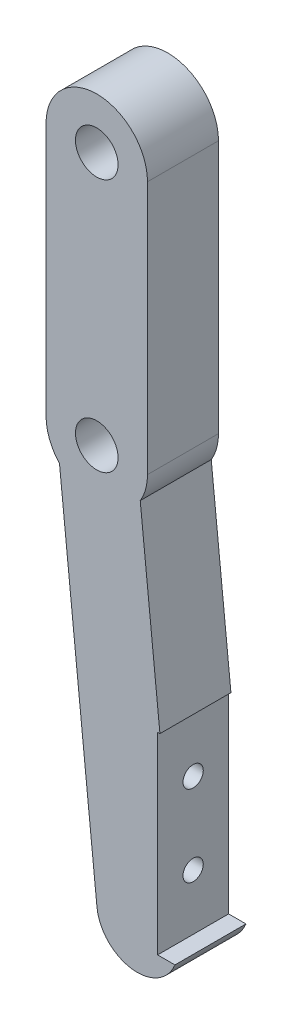
ISO-10303-21;
HEADER;
FILE_DESCRIPTION(('STEP AP214'),'2;1');
FILE_NAME('part.step','',(''),(''),'','','');
FILE_SCHEMA(('AUTOMOTIVE_DESIGN { 1 0 10303 214 1 1 1 1 }'));
ENDSEC;
DATA;
#1=APPLICATION_CONTEXT('core data for automotive mechanical design processes');
#2=APPLICATION_PROTOCOL_DEFINITION('international standard','automotive_design',2000,#1);
#3=PRODUCT_CONTEXT('',#1,'mechanical');
#4=PRODUCT('Part','Part','',(#3));
#5=PRODUCT_RELATED_PRODUCT_CATEGORY('part','',(#4));
#6=PRODUCT_DEFINITION_FORMATION('','',#4);
#7=PRODUCT_DEFINITION_CONTEXT('part definition',#1,'design');
#8=PRODUCT_DEFINITION('design','',#6,#7);
#9=PRODUCT_DEFINITION_SHAPE('','',#8);
#10=(LENGTH_UNIT() NAMED_UNIT(*) SI_UNIT(.MILLI.,.METRE.));
#11=(NAMED_UNIT(*) PLANE_ANGLE_UNIT() SI_UNIT($,.RADIAN.));
#12=(NAMED_UNIT(*) SI_UNIT($,.STERADIAN.) SOLID_ANGLE_UNIT());
#13=UNCERTAINTY_MEASURE_WITH_UNIT(LENGTH_MEASURE(1.E-05),#10,'distance_accuracy_value','');
#14=(GEOMETRIC_REPRESENTATION_CONTEXT(3) GLOBAL_UNCERTAINTY_ASSIGNED_CONTEXT((#13)) GLOBAL_UNIT_ASSIGNED_CONTEXT((#10,
#11,#12)) REPRESENTATION_CONTEXT('',''));
#15=CARTESIAN_POINT('',(0.,0.,0.));
#16=DIRECTION('',(0.,0.,1.));
#17=DIRECTION('',(1.,0.,0.));
#18=AXIS2_PLACEMENT_3D('',#15,#16,#17);
#19=CARTESIAN_POINT('',(3.4,-60.,3.5));
#20=DIRECTION('',(-1.,0.,0.));
#21=DIRECTION('',(0.,0.,1.));
#22=AXIS2_PLACEMENT_3D('',#19,#20,#21);
#23=PLANE('',#22);
#24=CARTESIAN_POINT('',(3.4,-60.,3.5));
#25=DIRECTION('',(-1.,0.,0.));
#26=DIRECTION('',(0.,0.,-1.));
#27=AXIS2_PLACEMENT_3D('',#24,#25,#26);
#28=CIRCLE('',#27,1.);
#29=CARTESIAN_POINT('',(3.4,-60.,2.5));
#30=VERTEX_POINT('',#29);
#31=EDGE_CURVE('E10',#30,#30,#28,.T.);
#32=ORIENTED_EDGE('',*,*,#31,.F.);
#33=EDGE_LOOP('',(#32));
#34=FACE_BOUND('',#33,.T.);
#35=ADVANCED_FACE('F16',(#34),#23,.F.);
#36=CARTESIAN_POINT('',(3.4,-52.,3.5));
#37=DIRECTION('',(-1.,0.,0.));
#38=DIRECTION('',(0.,0.,1.));
#39=AXIS2_PLACEMENT_3D('',#36,#37,#38);
#40=PLANE('',#39);
#41=CARTESIAN_POINT('',(3.4,-52.,3.5));
#42=DIRECTION('',(-1.,0.,0.));
#43=DIRECTION('',(0.,0.,-1.));
#44=AXIS2_PLACEMENT_3D('',#41,#42,#43);
#45=CIRCLE('',#44,1.);
#46=CARTESIAN_POINT('',(3.4,-52.,2.5));
#47=VERTEX_POINT('',#46);
#48=EDGE_CURVE('E43',#47,#47,#45,.T.);
#49=ORIENTED_EDGE('',*,*,#48,.F.);
#50=EDGE_LOOP('',(#49));
#51=FACE_BOUND('',#50,.T.);
#52=ADVANCED_FACE('F388',(#51),#40,.F.);
#53=CARTESIAN_POINT('',(6.,-60.,3.5));
#54=DIRECTION('',(-1.,0.,0.));
#55=DIRECTION('',(0.,0.,-1.));
#56=AXIS2_PLACEMENT_3D('',#53,#54,#55);
#57=CYLINDRICAL_SURFACE('',#56,1.);
#58=DIRECTION('',(-1.,0.,0.));
#59=VECTOR('',#58,1.);
#60=CARTESIAN_POINT('',(6.,-60.,2.5));
#61=LINE('',#60,#59);
#62=CARTESIAN_POINT('',(6.,-60.,2.5));
#63=VERTEX_POINT('',#62);
#64=EDGE_CURVE('E24',#63,#30,#61,.T.);
#65=ORIENTED_EDGE('',*,*,#64,.F.);
#66=CARTESIAN_POINT('',(6.,-60.,3.5));
#67=DIRECTION('',(-1.,0.,0.));
#68=DIRECTION('',(0.,0.,-1.));
#69=AXIS2_PLACEMENT_3D('',#66,#67,#68);
#70=CIRCLE('',#69,1.);
#71=EDGE_CURVE('E223',#63,#63,#70,.T.);
#72=ORIENTED_EDGE('',*,*,#71,.F.);
#73=ORIENTED_EDGE('',*,*,#64,.T.);
#74=ORIENTED_EDGE('',*,*,#31,.T.);
#75=EDGE_LOOP('',(#65,#72,#73,#74));
#76=FACE_BOUND('',#75,.T.);
#77=ADVANCED_FACE('F393',(#76),#57,.F.);
#78=CARTESIAN_POINT('',(6.,-52.,3.5));
#79=DIRECTION('',(-1.,0.,0.));
#80=DIRECTION('',(0.,0.,-1.));
#81=AXIS2_PLACEMENT_3D('',#78,#79,#80);
#82=CYLINDRICAL_SURFACE('',#81,1.);
#83=DIRECTION('',(-1.,0.,0.));
#84=VECTOR('',#83,1.);
#85=CARTESIAN_POINT('',(6.,-52.,2.5));
#86=LINE('',#85,#84);
#87=CARTESIAN_POINT('',(6.,-52.,2.5));
#88=VERTEX_POINT('',#87);
#89=EDGE_CURVE('E269',#88,#47,#86,.T.);
#90=ORIENTED_EDGE('',*,*,#89,.F.);
#91=CARTESIAN_POINT('',(6.,-52.,3.5));
#92=DIRECTION('',(-1.,0.,0.));
#93=DIRECTION('',(0.,0.,-1.));
#94=AXIS2_PLACEMENT_3D('',#91,#92,#93);
#95=CIRCLE('',#94,1.);
#96=EDGE_CURVE('E215',#88,#88,#95,.T.);
#97=ORIENTED_EDGE('',*,*,#96,.F.);
#98=ORIENTED_EDGE('',*,*,#89,.T.);
#99=ORIENTED_EDGE('',*,*,#48,.T.);
#100=EDGE_LOOP('',(#90,#97,#98,#99));
#101=FACE_BOUND('',#100,.T.);
#102=ADVANCED_FACE('F398',(#101),#82,.F.);
#103=CARTESIAN_POINT('',(0.,0.,0.));
#104=DIRECTION('',(0.,0.,-1.));
#105=DIRECTION('',(1.,0.,0.));
#106=AXIS2_PLACEMENT_3D('',#103,#104,#105);
#107=CYLINDRICAL_SURFACE('',#106,2.1);
#108=DIRECTION('',(0.,0.,1.));
#109=VECTOR('',#108,1.);
#110=CARTESIAN_POINT('',(2.1,0.,0.));
#111=LINE('',#110,#109);
#112=CARTESIAN_POINT('',(2.1,0.,0.));
#113=VERTEX_POINT('',#112);
#114=CARTESIAN_POINT('',(2.1,0.,7.));
#115=VERTEX_POINT('',#114);
#116=EDGE_CURVE('E266',#113,#115,#111,.T.);
#117=ORIENTED_EDGE('',*,*,#116,.T.);
#118=CARTESIAN_POINT('',(0.,0.,7.));
#119=DIRECTION('',(0.,0.,1.));
#120=DIRECTION('',(1.,0.,0.));
#121=AXIS2_PLACEMENT_3D('',#118,#119,#120);
#122=CIRCLE('',#121,2.1);
#123=EDGE_CURVE('E244',#115,#115,#122,.T.);
#124=ORIENTED_EDGE('',*,*,#123,.T.);
#125=ORIENTED_EDGE('',*,*,#116,.F.);
#126=CARTESIAN_POINT('',(0.,0.,0.));
#127=DIRECTION('',(0.,0.,1.));
#128=DIRECTION('',(1.,0.,0.));
#129=AXIS2_PLACEMENT_3D('',#126,#127,#128);
#130=CIRCLE('',#129,2.1);
#131=EDGE_CURVE('E204',#113,#113,#130,.T.);
#132=ORIENTED_EDGE('',*,*,#131,.F.);
#133=EDGE_LOOP('',(#117,#124,#125,#132));
#134=FACE_BOUND('',#133,.T.);
#135=ADVANCED_FACE('F383',(#134),#107,.F.);
#136=CARTESIAN_POINT('',(0.,-25.,0.));
#137=DIRECTION('',(0.,0.,-1.));
#138=DIRECTION('',(1.,0.,0.));
#139=AXIS2_PLACEMENT_3D('',#136,#137,#138);
#140=CYLINDRICAL_SURFACE('',#139,2.1);
#141=DIRECTION('',(0.,0.,1.));
#142=VECTOR('',#141,1.);
#143=CARTESIAN_POINT('',(2.1,-25.,0.));
#144=LINE('',#143,#142);
#145=CARTESIAN_POINT('',(2.1,-25.,0.));
#146=VERTEX_POINT('',#145);
#147=CARTESIAN_POINT('',(2.1,-25.,7.));
#148=VERTEX_POINT('',#147);
#149=EDGE_CURVE('E263',#146,#148,#144,.T.);
#150=ORIENTED_EDGE('',*,*,#149,.T.);
#151=CARTESIAN_POINT('',(0.,-25.,7.));
#152=DIRECTION('',(0.,0.,1.));
#153=DIRECTION('',(1.,0.,0.));
#154=AXIS2_PLACEMENT_3D('',#151,#152,#153);
#155=CIRCLE('',#154,2.1);
#156=EDGE_CURVE('E240',#148,#148,#155,.T.);
#157=ORIENTED_EDGE('',*,*,#156,.T.);
#158=ORIENTED_EDGE('',*,*,#149,.F.);
#159=CARTESIAN_POINT('',(0.,-25.,0.));
#160=DIRECTION('',(0.,0.,1.));
#161=DIRECTION('',(1.,0.,0.));
#162=AXIS2_PLACEMENT_3D('',#159,#160,#161);
#163=CIRCLE('',#162,2.1);
#164=EDGE_CURVE('E200',#146,#146,#163,.T.);
#165=ORIENTED_EDGE('',*,*,#164,.F.);
#166=EDGE_LOOP('',(#150,#157,#158,#165));
#167=FACE_BOUND('',#166,.T.);
#168=ADVANCED_FACE('F374',(#167),#140,.F.);
#169=CARTESIAN_POINT('',(9.,-46.5,0.));
#170=DIRECTION('',(0.,-1.,0.));
#171=DIRECTION('',(0.,0.,-1.));
#172=AXIS2_PLACEMENT_3D('',#169,#170,#171);
#173=PLANE('',#172);
#174=DIRECTION('',(-1.,0.,0.));
#175=VECTOR('',#174,1.);
#176=CARTESIAN_POINT('',(9.,-46.5,0.));
#177=LINE('',#176,#175);
#178=CARTESIAN_POINT('',(6.226111955674,-46.5,0.));
#179=VERTEX_POINT('',#178);
#180=CARTESIAN_POINT('',(6.,-46.5,0.));
#181=VERTEX_POINT('',#180);
#182=EDGE_CURVE('E184',#179,#181,#177,.T.);
#183=ORIENTED_EDGE('',*,*,#182,.F.);
#184=DIRECTION('',(0.,0.,-1.));
#185=VECTOR('',#184,1.);
#186=CARTESIAN_POINT('',(6.226111955674,-46.5,0.));
#187=LINE('',#186,#185);
#188=CARTESIAN_POINT('',(6.226111955674,-46.5,7.));
#189=VERTEX_POINT('',#188);
#190=EDGE_CURVE('E249',#189,#179,#187,.T.);
#191=ORIENTED_EDGE('',*,*,#190,.F.);
#192=DIRECTION('',(-1.,0.,0.));
#193=VECTOR('',#192,1.);
#194=CARTESIAN_POINT('',(4.5,-46.5,7.));
#195=LINE('',#194,#193);
#196=CARTESIAN_POINT('',(6.,-46.5,7.));
#197=VERTEX_POINT('',#196);
#198=EDGE_CURVE('E229',#189,#197,#195,.T.);
#199=ORIENTED_EDGE('',*,*,#198,.T.);
#200=DIRECTION('',(0.,0.,1.));
#201=VECTOR('',#200,1.);
#202=CARTESIAN_POINT('',(6.,-46.5,0.));
#203=LINE('',#202,#201);
#204=EDGE_CURVE('E169',#181,#197,#203,.T.);
#205=ORIENTED_EDGE('',*,*,#204,.F.);
#206=EDGE_LOOP('',(#183,#191,#199,#205));
#207=FACE_BOUND('',#206,.T.);
#208=ADVANCED_FACE('F372',(#207),#173,.T.);
#209=CARTESIAN_POINT('',(6.,-46.5,0.));
#210=DIRECTION('',(1.,0.,0.));
#211=DIRECTION('',(0.,1.,0.));
#212=AXIS2_PLACEMENT_3D('',#209,#210,#211);
#213=PLANE('',#212);
#214=ORIENTED_EDGE('',*,*,#71,.T.);
#215=EDGE_LOOP('',(#214));
#216=FACE_BOUND('',#215,.T.);
#217=ORIENTED_EDGE('',*,*,#96,.T.);
#218=EDGE_LOOP('',(#217));
#219=FACE_BOUND('',#218,.T.);
#220=DIRECTION('',(0.,-1.,0.));
#221=VECTOR('',#220,1.);
#222=CARTESIAN_POINT('',(6.,-46.5,0.));
#223=LINE('',#222,#221);
#224=CARTESIAN_POINT('',(6.,-65.5,0.));
#225=VERTEX_POINT('',#224);
#226=EDGE_CURVE('E161',#181,#225,#223,.T.);
#227=ORIENTED_EDGE('',*,*,#226,.F.);
#228=ORIENTED_EDGE('',*,*,#204,.T.);
#229=DIRECTION('',(0.,-1.,0.));
#230=VECTOR('',#229,1.);
#231=CARTESIAN_POINT('',(6.,-29.5,7.));
#232=LINE('',#231,#230);
#233=CARTESIAN_POINT('',(6.,-65.5,7.));
#234=VERTEX_POINT('',#233);
#235=EDGE_CURVE('E164',#197,#234,#232,.T.);
#236=ORIENTED_EDGE('',*,*,#235,.T.);
#237=DIRECTION('',(0.,0.,1.));
#238=VECTOR('',#237,1.);
#239=CARTESIAN_POINT('',(6.,-65.5,0.));
#240=LINE('',#239,#238);
#241=EDGE_CURVE('E157',#225,#234,#240,.T.);
#242=ORIENTED_EDGE('',*,*,#241,.F.);
#243=EDGE_LOOP('',(#227,#228,#236,#242));
#244=FACE_BOUND('',#243,.T.);
#245=ADVANCED_FACE('F159',(#216,#219,#244),#213,.T.);
#246=CARTESIAN_POINT('',(6.,-65.5,0.));
#247=DIRECTION('',(0.,1.,0.));
#248=DIRECTION('',(1.,0.,0.));
#249=AXIS2_PLACEMENT_3D('',#246,#247,#248);
#250=PLANE('',#249);
#251=DIRECTION('',(1.,0.,0.));
#252=VECTOR('',#251,1.);
#253=CARTESIAN_POINT('',(6.,-65.5,0.));
#254=LINE('',#253,#252);
#255=CARTESIAN_POINT('',(7.708099243548,-65.5,0.));
#256=VERTEX_POINT('',#255);
#257=EDGE_CURVE('E173',#225,#256,#254,.T.);
#258=ORIENTED_EDGE('',*,*,#257,.F.);
#259=ORIENTED_EDGE('',*,*,#241,.T.);
#260=DIRECTION('',(1.,0.,0.));
#261=VECTOR('',#260,1.);
#262=CARTESIAN_POINT('',(3.,-65.5,7.));
#263=LINE('',#262,#261);
#264=CARTESIAN_POINT('',(7.708099243548,-65.5,7.));
#265=VERTEX_POINT('',#264);
#266=EDGE_CURVE('E224',#234,#265,#263,.T.);
#267=ORIENTED_EDGE('',*,*,#266,.T.);
#268=DIRECTION('',(0.,0.,-1.));
#269=VECTOR('',#268,1.);
#270=CARTESIAN_POINT('',(7.708099243548,-65.5,0.));
#271=LINE('',#270,#269);
#272=EDGE_CURVE('E170',#265,#256,#271,.T.);
#273=ORIENTED_EDGE('',*,*,#272,.T.);
#274=EDGE_LOOP('',(#258,#259,#267,#273));
#275=FACE_BOUND('',#274,.T.);
#276=ADVANCED_FACE('F174',(#275),#250,.T.);
#277=CARTESIAN_POINT('',(4.,-64.,0.));
#278=DIRECTION('',(0.,0.,-1.));
#279=DIRECTION('',(0.994781438611008,0.102028865499001,0.));
#280=AXIS2_PLACEMENT_3D('',#277,#278,#279);
#281=CYLINDRICAL_SURFACE('',#280,4.);
#282=CARTESIAN_POINT('',(4.,-64.,0.));
#283=DIRECTION('',(0.,0.,-1.));
#284=DIRECTION('',(0.994781438611008,0.102028865499001,0.));
#285=AXIS2_PLACEMENT_3D('',#282,#283,#284);
#286=CIRCLE('',#285,4.);
#287=CARTESIAN_POINT('',(0.02087424555579,-64.40811546199,0.));
#288=VERTEX_POINT('',#287);
#289=EDGE_CURVE('E179',#256,#288,#286,.T.);
#290=ORIENTED_EDGE('',*,*,#289,.F.);
#291=ORIENTED_EDGE('',*,*,#272,.F.);
#292=CARTESIAN_POINT('',(4.,-64.,7.));
#293=DIRECTION('',(0.,0.,-1.));
#294=DIRECTION('',(0.994781438611008,0.102028865499001,0.));
#295=AXIS2_PLACEMENT_3D('',#292,#293,#294);
#296=CIRCLE('',#295,4.);
#297=CARTESIAN_POINT('',(0.02087424555579,-64.40811546199,7.));
#298=VERTEX_POINT('',#297);
#299=EDGE_CURVE('E219',#265,#298,#296,.T.);
#300=ORIENTED_EDGE('',*,*,#299,.T.);
#301=DIRECTION('',(0.,0.,1.));
#302=VECTOR('',#301,1.);
#303=CARTESIAN_POINT('',(0.02087424555579,-64.40811546199,0.));
#304=LINE('',#303,#302);
#305=EDGE_CURVE('E255',#288,#298,#304,.T.);
#306=ORIENTED_EDGE('',*,*,#305,.F.);
#307=EDGE_LOOP('',(#290,#291,#300,#306));
#308=FACE_BOUND('',#307,.T.);
#309=ADVANCED_FACE('F304',(#308),#281,.T.);
#310=CARTESIAN_POINT('',(0.02087424555579,-64.40811546199,0.));
#311=DIRECTION('',(-0.994781438611008,-0.102028865499001,0.));
#312=DIRECTION('',(-0.102028865499001,0.994781438611008,0.));
#313=AXIS2_PLACEMENT_3D('',#310,#311,#312);
#314=PLANE('',#313);
#315=DIRECTION('',(-0.102028865499001,0.994781438611008,0.));
#316=VECTOR('',#315,1.);
#317=CARTESIAN_POINT('',(0.02087424555579,-64.40811546199,0.));
#318=LINE('',#317,#316);
#319=CARTESIAN_POINT('',(-3.673039157949,-28.39245977782,0.));
#320=VERTEX_POINT('',#319);
#321=EDGE_CURVE('E193',#288,#320,#318,.T.);
#322=ORIENTED_EDGE('',*,*,#321,.F.);
#323=ORIENTED_EDGE('',*,*,#305,.T.);
#324=DIRECTION('',(-0.102028865499001,0.994781438611008,0.));
#325=VECTOR('',#324,1.);
#326=CARTESIAN_POINT('',(0.02087424555579,-64.40811546199,7.));
#327=LINE('',#326,#325);
#328=CARTESIAN_POINT('',(-3.673039157949,-28.39245977782,7.));
#329=VERTEX_POINT('',#328);
#330=EDGE_CURVE('E212',#298,#329,#327,.T.);
#331=ORIENTED_EDGE('',*,*,#330,.T.);
#332=DIRECTION('',(0.,0.,-1.));
#333=VECTOR('',#332,1.);
#334=CARTESIAN_POINT('',(-3.673039157949,-28.39245977782,0.));
#335=LINE('',#334,#333);
#336=EDGE_CURVE('E252',#329,#320,#335,.T.);
#337=ORIENTED_EDGE('',*,*,#336,.T.);
#338=EDGE_LOOP('',(#322,#323,#331,#337));
#339=FACE_BOUND('',#338,.T.);
#340=ADVANCED_FACE('F309',(#339),#314,.T.);
#341=CARTESIAN_POINT('',(0.,-25.,0.));
#342=DIRECTION('',(0.,0.,-1.));
#343=DIRECTION('',(1.,0.,0.));
#344=AXIS2_PLACEMENT_3D('',#341,#342,#343);
#345=CYLINDRICAL_SURFACE('',#344,5.);
#346=CARTESIAN_POINT('',(0.,-25.,0.));
#347=DIRECTION('',(0.,0.,-1.));
#348=DIRECTION('',(1.,0.,0.));
#349=AXIS2_PLACEMENT_3D('',#346,#347,#348);
#350=CIRCLE('',#349,5.);
#351=CARTESIAN_POINT('',(-5.,-25.,0.));
#352=VERTEX_POINT('',#351);
#353=EDGE_CURVE('E196',#320,#352,#350,.T.);
#354=ORIENTED_EDGE('',*,*,#353,.F.);
#355=ORIENTED_EDGE('',*,*,#336,.F.);
#356=CARTESIAN_POINT('',(0.,-25.,7.));
#357=DIRECTION('',(0.,0.,-1.));
#358=DIRECTION('',(1.,0.,0.));
#359=AXIS2_PLACEMENT_3D('',#356,#357,#358);
#360=CIRCLE('',#359,5.);
#361=CARTESIAN_POINT('',(-5.,-25.,7.));
#362=VERTEX_POINT('',#361);
#363=EDGE_CURVE('E208',#329,#362,#360,.T.);
#364=ORIENTED_EDGE('',*,*,#363,.T.);
#365=DIRECTION('',(0.,0.,1.));
#366=VECTOR('',#365,1.);
#367=CARTESIAN_POINT('',(-5.,-25.,0.));
#368=LINE('',#367,#366);
#369=EDGE_CURVE('E248',#352,#362,#368,.T.);
#370=ORIENTED_EDGE('',*,*,#369,.F.);
#371=EDGE_LOOP('',(#354,#355,#364,#370));
#372=FACE_BOUND('',#371,.T.);
#373=ADVANCED_FACE('F313',(#372),#345,.T.);
#374=CARTESIAN_POINT('',(3.979125754444,-24.591884538,0.));
#375=DIRECTION('',(0.994781438611008,0.102028865499001,0.));
#376=DIRECTION('',(0.,0.,-1.));
#377=AXIS2_PLACEMENT_3D('',#374,#375,#376);
#378=PLANE('',#377);
#379=DIRECTION('',(0.102028865499001,-0.994781438611008,0.));
#380=VECTOR('',#379,1.);
#381=CARTESIAN_POINT('',(3.979125754444,-24.591884538,0.));
#382=LINE('',#381,#380);
#383=CARTESIAN_POINT('',(4.28521235094,-27.57622885383,0.));
#384=VERTEX_POINT('',#383);
#385=EDGE_CURVE('E190',#384,#179,#382,.T.);
#386=ORIENTED_EDGE('',*,*,#385,.F.);
#387=DIRECTION('',(0.,0.,-1.));
#388=VECTOR('',#387,1.);
#389=CARTESIAN_POINT('',(4.28521235094,-27.57622885383,0.));
#390=LINE('',#389,#388);
#391=CARTESIAN_POINT('',(4.28521235094,-27.57622885383,7.));
#392=VERTEX_POINT('',#391);
#393=EDGE_CURVE('E296',#392,#384,#390,.T.);
#394=ORIENTED_EDGE('',*,*,#393,.F.);
#395=DIRECTION('',(0.102028865499001,-0.994781438611008,0.));
#396=VECTOR('',#395,1.);
#397=CARTESIAN_POINT('',(3.979125754444,-24.591884538,7.));
#398=LINE('',#397,#396);
#399=EDGE_CURVE('E233',#392,#189,#398,.T.);
#400=ORIENTED_EDGE('',*,*,#399,.T.);
#401=ORIENTED_EDGE('',*,*,#190,.T.);
#402=EDGE_LOOP('',(#386,#394,#400,#401));
#403=FACE_BOUND('',#402,.T.);
#404=ADVANCED_FACE('F352',(#403),#378,.T.);
#405=CARTESIAN_POINT('',(-5.,-25.,0.));
#406=DIRECTION('',(-1.,0.,0.));
#407=DIRECTION('',(0.,1.,0.));
#408=AXIS2_PLACEMENT_3D('',#405,#406,#407);
#409=PLANE('',#408);
#410=ORIENTED_EDGE('',*,*,#369,.T.);
#411=DIRECTION('',(0.,1.,0.));
#412=VECTOR('',#411,1.);
#413=CARTESIAN_POINT('',(-5.,-25.,7.));
#414=LINE('',#413,#412);
#415=CARTESIAN_POINT('',(-5.,0.,7.));
#416=VERTEX_POINT('',#415);
#417=EDGE_CURVE('E237',#362,#416,#414,.T.);
#418=ORIENTED_EDGE('',*,*,#417,.T.);
#419=DIRECTION('',(0.,0.,1.));
#420=VECTOR('',#419,1.);
#421=CARTESIAN_POINT('',(-5.,0.,0.));
#422=LINE('',#421,#420);
#423=CARTESIAN_POINT('',(-5.,0.,0.));
#424=VERTEX_POINT('',#423);
#425=EDGE_CURVE('E281',#424,#416,#422,.T.);
#426=ORIENTED_EDGE('',*,*,#425,.F.);
#427=DIRECTION('',(0.,1.,0.));
#428=VECTOR('',#427,1.);
#429=CARTESIAN_POINT('',(-5.,-25.,0.));
#430=LINE('',#429,#428);
#431=EDGE_CURVE('E297',#352,#424,#430,.T.);
#432=ORIENTED_EDGE('',*,*,#431,.F.);
#433=EDGE_LOOP('',(#410,#418,#426,#432));
#434=FACE_BOUND('',#433,.T.);
#435=ADVANCED_FACE('F318',(#434),#409,.T.);
#436=CARTESIAN_POINT('',(0.,-12.5,7.));
#437=DIRECTION('',(0.,0.,-1.));
#438=DIRECTION('',(0.,-1.,0.));
#439=AXIS2_PLACEMENT_3D('',#436,#437,#438);
#440=PLANE('',#439);
#441=ORIENTED_EDGE('',*,*,#123,.F.);
#442=EDGE_LOOP('',(#441));
#443=FACE_BOUND('',#442,.T.);
#444=ORIENTED_EDGE('',*,*,#156,.F.);
#445=EDGE_LOOP('',(#444));
#446=FACE_BOUND('',#445,.T.);
#447=ORIENTED_EDGE('',*,*,#363,.F.);
#448=ORIENTED_EDGE('',*,*,#330,.F.);
#449=ORIENTED_EDGE('',*,*,#299,.F.);
#450=ORIENTED_EDGE('',*,*,#266,.F.);
#451=ORIENTED_EDGE('',*,*,#235,.F.);
#452=ORIENTED_EDGE('',*,*,#198,.F.);
#453=ORIENTED_EDGE('',*,*,#399,.F.);
#454=CARTESIAN_POINT('',(0.,-25.,7.));
#455=DIRECTION('',(0.,0.,-1.));
#456=DIRECTION('',(1.,0.,0.));
#457=AXIS2_PLACEMENT_3D('',#454,#455,#456);
#458=CIRCLE('',#457,5.);
#459=CARTESIAN_POINT('',(5.,-25.,7.));
#460=VERTEX_POINT('',#459);
#461=EDGE_CURVE('E292',#460,#392,#458,.T.);
#462=ORIENTED_EDGE('',*,*,#461,.F.);
#463=DIRECTION('',(0.,-1.,0.));
#464=VECTOR('',#463,1.);
#465=CARTESIAN_POINT('',(5.,0.,7.));
#466=LINE('',#465,#464);
#467=CARTESIAN_POINT('',(5.,0.,7.));
#468=VERTEX_POINT('',#467);
#469=EDGE_CURVE('E337',#468,#460,#466,.T.);
#470=ORIENTED_EDGE('',*,*,#469,.F.);
#471=CARTESIAN_POINT('',(0.,0.,7.));
#472=DIRECTION('',(0.,0.,-1.));
#473=DIRECTION('',(-1.,0.,0.));
#474=AXIS2_PLACEMENT_3D('',#471,#472,#473);
#475=CIRCLE('',#474,5.);
#476=EDGE_CURVE('E283',#416,#468,#475,.T.);
#477=ORIENTED_EDGE('',*,*,#476,.F.);
#478=ORIENTED_EDGE('',*,*,#417,.F.);
#479=EDGE_LOOP('',(#447,#448,#449,#450,#451,#452,#453,#462,#470,#477,#478));
#480=FACE_BOUND('',#479,.T.);
#481=ADVANCED_FACE('F369',(#443,#446,#480),#440,.F.);
#482=CARTESIAN_POINT('',(0.,-12.5,0.));
#483=DIRECTION('',(0.,0.,-1.));
#484=DIRECTION('',(0.,-1.,0.));
#485=AXIS2_PLACEMENT_3D('',#482,#483,#484);
#486=PLANE('',#485);
#487=ORIENTED_EDGE('',*,*,#131,.T.);
#488=EDGE_LOOP('',(#487));
#489=FACE_BOUND('',#488,.T.);
#490=ORIENTED_EDGE('',*,*,#164,.T.);
#491=EDGE_LOOP('',(#490));
#492=FACE_BOUND('',#491,.T.);
#493=ORIENTED_EDGE('',*,*,#431,.T.);
#494=CARTESIAN_POINT('',(0.,0.,0.));
#495=DIRECTION('',(0.,0.,-1.));
#496=DIRECTION('',(-1.,0.,0.));
#497=AXIS2_PLACEMENT_3D('',#494,#495,#496);
#498=CIRCLE('',#497,5.);
#499=CARTESIAN_POINT('',(5.,0.,0.));
#500=VERTEX_POINT('',#499);
#501=EDGE_CURVE('E284',#424,#500,#498,.T.);
#502=ORIENTED_EDGE('',*,*,#501,.T.);
#503=DIRECTION('',(0.,-1.,0.));
#504=VECTOR('',#503,1.);
#505=CARTESIAN_POINT('',(5.,0.,0.));
#506=LINE('',#505,#504);
#507=CARTESIAN_POINT('',(5.,-25.,0.));
#508=VERTEX_POINT('',#507);
#509=EDGE_CURVE('E323',#500,#508,#506,.T.);
#510=ORIENTED_EDGE('',*,*,#509,.T.);
#511=CARTESIAN_POINT('',(0.,-25.,0.));
#512=DIRECTION('',(0.,0.,-1.));
#513=DIRECTION('',(1.,0.,0.));
#514=AXIS2_PLACEMENT_3D('',#511,#512,#513);
#515=CIRCLE('',#514,5.);
#516=EDGE_CURVE('E288',#508,#384,#515,.T.);
#517=ORIENTED_EDGE('',*,*,#516,.T.);
#518=ORIENTED_EDGE('',*,*,#385,.T.);
#519=ORIENTED_EDGE('',*,*,#182,.T.);
#520=ORIENTED_EDGE('',*,*,#226,.T.);
#521=ORIENTED_EDGE('',*,*,#257,.T.);
#522=ORIENTED_EDGE('',*,*,#289,.T.);
#523=ORIENTED_EDGE('',*,*,#321,.T.);
#524=ORIENTED_EDGE('',*,*,#353,.T.);
#525=EDGE_LOOP('',(#493,#502,#510,#517,#518,#519,#520,#521,#522,#523,#524));
#526=FACE_BOUND('',#525,.T.);
#527=ADVANCED_FACE('F181',(#489,#492,#526),#486,.T.);
#528=CARTESIAN_POINT('',(0.,-25.,0.));
#529=DIRECTION('',(0.,0.,-1.));
#530=DIRECTION('',(1.,0.,0.));
#531=AXIS2_PLACEMENT_3D('',#528,#529,#530);
#532=CYLINDRICAL_SURFACE('',#531,5.);
#533=ORIENTED_EDGE('',*,*,#516,.F.);
#534=DIRECTION('',(0.,0.,1.));
#535=VECTOR('',#534,1.);
#536=CARTESIAN_POINT('',(5.,-25.,0.));
#537=LINE('',#536,#535);
#538=EDGE_CURVE('E328',#508,#460,#537,.T.);
#539=ORIENTED_EDGE('',*,*,#538,.T.);
#540=ORIENTED_EDGE('',*,*,#461,.T.);
#541=ORIENTED_EDGE('',*,*,#393,.T.);
#542=EDGE_LOOP('',(#533,#539,#540,#541));
#543=FACE_BOUND('',#542,.T.);
#544=ADVANCED_FACE('F354',(#543),#532,.T.);
#545=CARTESIAN_POINT('',(0.,0.,0.));
#546=DIRECTION('',(0.,0.,-1.));
#547=DIRECTION('',(-1.,0.,0.));
#548=AXIS2_PLACEMENT_3D('',#545,#546,#547);
#549=CYLINDRICAL_SURFACE('',#548,5.);
#550=ORIENTED_EDGE('',*,*,#425,.T.);
#551=ORIENTED_EDGE('',*,*,#476,.T.);
#552=DIRECTION('',(0.,0.,1.));
#553=VECTOR('',#552,1.);
#554=CARTESIAN_POINT('',(5.,0.,0.));
#555=LINE('',#554,#553);
#556=EDGE_CURVE('E359',#500,#468,#555,.T.);
#557=ORIENTED_EDGE('',*,*,#556,.F.);
#558=ORIENTED_EDGE('',*,*,#501,.F.);
#559=EDGE_LOOP('',(#550,#551,#557,#558));
#560=FACE_BOUND('',#559,.T.);
#561=ADVANCED_FACE('F428',(#560),#549,.T.);
#562=CARTESIAN_POINT('',(5.,0.,0.));
#563=DIRECTION('',(1.,0.,0.));
#564=DIRECTION('',(0.,1.,0.));
#565=AXIS2_PLACEMENT_3D('',#562,#563,#564);
#566=PLANE('',#565);
#567=ORIENTED_EDGE('',*,*,#556,.T.);
#568=ORIENTED_EDGE('',*,*,#469,.T.);
#569=ORIENTED_EDGE('',*,*,#538,.F.);
#570=ORIENTED_EDGE('',*,*,#509,.F.);
#571=EDGE_LOOP('',(#567,#568,#569,#570));
#572=FACE_BOUND('',#571,.T.);
#573=ADVANCED_FACE('F367',(#572),#566,.T.);
#574=CLOSED_SHELL('',(#35,#52,#77,#102,#135,#168,#208,#245,#276,#309,#340,#373,#404,#435,#481,
#527,#544,#561,#573));
#575=MANIFOLD_SOLID_BREP('B1',#574);
#576=ADVANCED_BREP_SHAPE_REPRESENTATION('',(#18,#575),#14);
#577=SHAPE_DEFINITION_REPRESENTATION(#9,#576);
ENDSEC;
END-ISO-10303-21;
